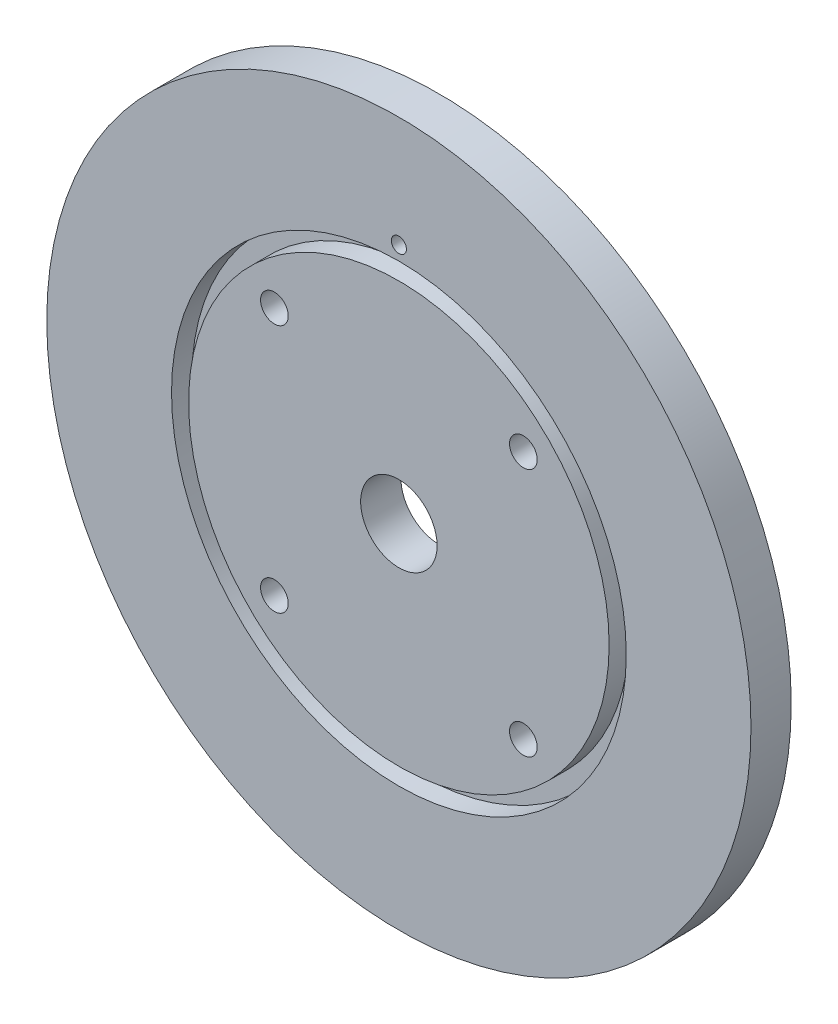
ISO-10303-21;
HEADER;
FILE_DESCRIPTION(('STEP AP214'),'2;1');
FILE_NAME('part.step','',(''),(''),'','','');
FILE_SCHEMA(('AUTOMOTIVE_DESIGN { 1 0 10303 214 1 1 1 1 }'));
ENDSEC;
DATA;
#1=APPLICATION_CONTEXT('core data for automotive mechanical design processes');
#2=APPLICATION_PROTOCOL_DEFINITION('international standard','automotive_design',2000,#1);
#3=PRODUCT_CONTEXT('',#1,'mechanical');
#4=PRODUCT('Part','Part','',(#3));
#5=PRODUCT_RELATED_PRODUCT_CATEGORY('part','',(#4));
#6=PRODUCT_DEFINITION_FORMATION('','',#4);
#7=PRODUCT_DEFINITION_CONTEXT('part definition',#1,'design');
#8=PRODUCT_DEFINITION('design','',#6,#7);
#9=PRODUCT_DEFINITION_SHAPE('','',#8);
#10=(LENGTH_UNIT() NAMED_UNIT(*) SI_UNIT(.MILLI.,.METRE.));
#11=(NAMED_UNIT(*) PLANE_ANGLE_UNIT() SI_UNIT($,.RADIAN.));
#12=(NAMED_UNIT(*) SI_UNIT($,.STERADIAN.) SOLID_ANGLE_UNIT());
#13=UNCERTAINTY_MEASURE_WITH_UNIT(LENGTH_MEASURE(1.E-05),#10,'distance_accuracy_value','');
#14=(GEOMETRIC_REPRESENTATION_CONTEXT(3) GLOBAL_UNCERTAINTY_ASSIGNED_CONTEXT((#13)) GLOBAL_UNIT_ASSIGNED_CONTEXT((#10,
#11,#12)) REPRESENTATION_CONTEXT('',''));
#15=CARTESIAN_POINT('',(0.,0.,0.));
#16=DIRECTION('',(0.,0.,1.));
#17=DIRECTION('',(1.,0.,0.));
#18=AXIS2_PLACEMENT_3D('',#15,#16,#17);
#19=CARTESIAN_POINT('',(0.,0.,0.));
#20=DIRECTION('',(0.,0.,1.));
#21=DIRECTION('',(1.,0.,0.));
#22=AXIS2_PLACEMENT_3D('',#19,#20,#21);
#23=PLANE('',#22);
#24=CARTESIAN_POINT('',(0.,0.,0.));
#25=DIRECTION('',(0.,0.,1.));
#26=DIRECTION('',(1.,0.,0.));
#27=AXIS2_PLACEMENT_3D('',#24,#25,#26);
#28=CIRCLE('',#27,7.6);
#29=CARTESIAN_POINT('',(7.6,0.,0.));
#30=VERTEX_POINT('',#29);
#31=EDGE_CURVE('E52',#30,#30,#28,.T.);
#32=ORIENTED_EDGE('',*,*,#31,.F.);
#33=EDGE_LOOP('',(#32));
#34=FACE_BOUND('',#33,.T.);
#35=CARTESIAN_POINT('',(24.7487373415292,24.7487373415292,0.));
#36=DIRECTION('',(0.,0.,1.));
#37=DIRECTION('',(1.,0.,0.));
#38=AXIS2_PLACEMENT_3D('',#35,#36,#37);
#39=CIRCLE('',#38,2.75);
#40=CARTESIAN_POINT('',(27.4987373415292,24.7487373415292,0.));
#41=VERTEX_POINT('',#40);
#42=EDGE_CURVE('E58',#41,#41,#39,.T.);
#43=ORIENTED_EDGE('',*,*,#42,.F.);
#44=EDGE_LOOP('',(#43));
#45=FACE_BOUND('',#44,.T.);
#46=CARTESIAN_POINT('',(-24.7487373415292,24.7487373415292,0.));
#47=DIRECTION('',(0.,0.,1.));
#48=DIRECTION('',(1.,0.,0.));
#49=AXIS2_PLACEMENT_3D('',#46,#47,#48);
#50=CIRCLE('',#49,2.75);
#51=CARTESIAN_POINT('',(-21.9987373415292,24.7487373415292,0.));
#52=VERTEX_POINT('',#51);
#53=EDGE_CURVE('E64',#52,#52,#50,.T.);
#54=ORIENTED_EDGE('',*,*,#53,.F.);
#55=EDGE_LOOP('',(#54));
#56=FACE_BOUND('',#55,.T.);
#57=CARTESIAN_POINT('',(-24.7487373415292,-24.7487373415292,0.));
#58=DIRECTION('',(0.,0.,1.));
#59=DIRECTION('',(1.,0.,0.));
#60=AXIS2_PLACEMENT_3D('',#57,#58,#59);
#61=CIRCLE('',#60,2.75);
#62=CARTESIAN_POINT('',(-21.9987373415292,-24.7487373415292,0.));
#63=VERTEX_POINT('',#62);
#64=EDGE_CURVE('E70',#63,#63,#61,.T.);
#65=ORIENTED_EDGE('',*,*,#64,.F.);
#66=EDGE_LOOP('',(#65));
#67=FACE_BOUND('',#66,.T.);
#68=CARTESIAN_POINT('',(24.7487373415292,-24.7487373415292,0.));
#69=DIRECTION('',(0.,0.,1.));
#70=DIRECTION('',(1.,0.,0.));
#71=AXIS2_PLACEMENT_3D('',#68,#69,#70);
#72=CIRCLE('',#71,2.75);
#73=CARTESIAN_POINT('',(27.4987373415292,-24.7487373415292,0.));
#74=VERTEX_POINT('',#73);
#75=EDGE_CURVE('E76',#74,#74,#72,.T.);
#76=ORIENTED_EDGE('',*,*,#75,.F.);
#77=EDGE_LOOP('',(#76));
#78=FACE_BOUND('',#77,.T.);
#79=CARTESIAN_POINT('',(0.,0.,0.));
#80=DIRECTION('',(0.,0.,1.));
#81=DIRECTION('',(1.,0.,0.));
#82=AXIS2_PLACEMENT_3D('',#79,#80,#81);
#83=CIRCLE('',#82,41.8);
#84=CARTESIAN_POINT('',(41.8,0.,0.));
#85=VERTEX_POINT('',#84);
#86=EDGE_CURVE('E94',#85,#85,#83,.T.);
#87=ORIENTED_EDGE('',*,*,#86,.T.);
#88=EDGE_LOOP('',(#87));
#89=FACE_BOUND('',#88,.T.);
#90=ADVANCED_FACE('F39',(#34,#45,#56,#67,#78,#89),#23,.T.);
#91=CARTESIAN_POINT('',(0.,0.,-8.));
#92=DIRECTION('',(0.,0.,1.));
#93=DIRECTION('',(1.,0.,0.));
#94=AXIS2_PLACEMENT_3D('',#91,#92,#93);
#95=CYLINDRICAL_SURFACE('',#94,70.);
#96=CARTESIAN_POINT('',(0.,0.,-8.));
#97=DIRECTION('',(0.,0.,1.));
#98=DIRECTION('',(1.,0.,0.));
#99=AXIS2_PLACEMENT_3D('',#96,#97,#98);
#100=CIRCLE('',#99,70.);
#101=CARTESIAN_POINT('',(70.,0.,-8.));
#102=VERTEX_POINT('',#101);
#103=EDGE_CURVE('E10',#102,#102,#100,.T.);
#104=ORIENTED_EDGE('',*,*,#103,.T.);
#105=EDGE_LOOP('',(#104));
#106=FACE_BOUND('',#105,.T.);
#107=CARTESIAN_POINT('',(0.,0.,0.));
#108=DIRECTION('',(0.,0.,1.));
#109=DIRECTION('',(1.,0.,0.));
#110=AXIS2_PLACEMENT_3D('',#107,#108,#109);
#111=CIRCLE('',#110,70.);
#112=CARTESIAN_POINT('',(70.,0.,0.));
#113=VERTEX_POINT('',#112);
#114=EDGE_CURVE('E43',#113,#113,#111,.T.);
#115=ORIENTED_EDGE('',*,*,#114,.F.);
#116=EDGE_LOOP('',(#115));
#117=FACE_BOUND('',#116,.T.);
#118=ADVANCED_FACE('F41',(#106,#117),#95,.T.);
#119=CARTESIAN_POINT('',(0.,0.,-8.));
#120=DIRECTION('',(0.,0.,1.));
#121=DIRECTION('',(1.,0.,0.));
#122=AXIS2_PLACEMENT_3D('',#119,#120,#121);
#123=PLANE('',#122);
#124=CARTESIAN_POINT('',(0.,48.,-8.));
#125=DIRECTION('',(0.,0.,1.));
#126=DIRECTION('',(1.,0.,0.));
#127=AXIS2_PLACEMENT_3D('',#124,#125,#126);
#128=CIRCLE('',#127,1.5);
#129=CARTESIAN_POINT('',(1.5,48.,-8.));
#130=VERTEX_POINT('',#129);
#131=EDGE_CURVE('E79',#130,#130,#128,.T.);
#132=ORIENTED_EDGE('',*,*,#131,.T.);
#133=EDGE_LOOP('',(#132));
#134=FACE_BOUND('',#133,.T.);
#135=CARTESIAN_POINT('',(24.7487373415292,-24.7487373415292,-8.));
#136=DIRECTION('',(0.,0.,1.));
#137=DIRECTION('',(1.,0.,0.));
#138=AXIS2_PLACEMENT_3D('',#135,#136,#137);
#139=CIRCLE('',#138,2.75);
#140=CARTESIAN_POINT('',(27.4987373415292,-24.7487373415292,-8.));
#141=VERTEX_POINT('',#140);
#142=EDGE_CURVE('E73',#141,#141,#139,.T.);
#143=ORIENTED_EDGE('',*,*,#142,.T.);
#144=EDGE_LOOP('',(#143));
#145=FACE_BOUND('',#144,.T.);
#146=CARTESIAN_POINT('',(-24.7487373415292,-24.7487373415292,-8.));
#147=DIRECTION('',(0.,0.,1.));
#148=DIRECTION('',(1.,0.,0.));
#149=AXIS2_PLACEMENT_3D('',#146,#147,#148);
#150=CIRCLE('',#149,2.75);
#151=CARTESIAN_POINT('',(-21.9987373415292,-24.7487373415292,-8.));
#152=VERTEX_POINT('',#151);
#153=EDGE_CURVE('E67',#152,#152,#150,.T.);
#154=ORIENTED_EDGE('',*,*,#153,.T.);
#155=EDGE_LOOP('',(#154));
#156=FACE_BOUND('',#155,.T.);
#157=CARTESIAN_POINT('',(-24.7487373415292,24.7487373415292,-8.));
#158=DIRECTION('',(0.,0.,1.));
#159=DIRECTION('',(1.,0.,0.));
#160=AXIS2_PLACEMENT_3D('',#157,#158,#159);
#161=CIRCLE('',#160,2.75);
#162=CARTESIAN_POINT('',(-21.9987373415292,24.7487373415292,-8.));
#163=VERTEX_POINT('',#162);
#164=EDGE_CURVE('E61',#163,#163,#161,.T.);
#165=ORIENTED_EDGE('',*,*,#164,.T.);
#166=EDGE_LOOP('',(#165));
#167=FACE_BOUND('',#166,.T.);
#168=CARTESIAN_POINT('',(24.7487373415292,24.7487373415292,-8.));
#169=DIRECTION('',(0.,0.,1.));
#170=DIRECTION('',(1.,0.,0.));
#171=AXIS2_PLACEMENT_3D('',#168,#169,#170);
#172=CIRCLE('',#171,2.75);
#173=CARTESIAN_POINT('',(27.4987373415292,24.7487373415292,-8.));
#174=VERTEX_POINT('',#173);
#175=EDGE_CURVE('E55',#174,#174,#172,.T.);
#176=ORIENTED_EDGE('',*,*,#175,.T.);
#177=EDGE_LOOP('',(#176));
#178=FACE_BOUND('',#177,.T.);
#179=CARTESIAN_POINT('',(0.,0.,-8.));
#180=DIRECTION('',(0.,0.,1.));
#181=DIRECTION('',(1.,0.,0.));
#182=AXIS2_PLACEMENT_3D('',#179,#180,#181);
#183=CIRCLE('',#182,7.6);
#184=CARTESIAN_POINT('',(7.6,0.,-8.));
#185=VERTEX_POINT('',#184);
#186=EDGE_CURVE('E50',#185,#185,#183,.T.);
#187=ORIENTED_EDGE('',*,*,#186,.T.);
#188=EDGE_LOOP('',(#187));
#189=FACE_BOUND('',#188,.T.);
#190=ORIENTED_EDGE('',*,*,#103,.F.);
#191=EDGE_LOOP('',(#190));
#192=FACE_BOUND('',#191,.T.);
#193=ADVANCED_FACE('F120',(#134,#145,#156,#167,#178,#189,#192),#123,.F.);
#194=CARTESIAN_POINT('',(0.,0.,0.));
#195=DIRECTION('',(0.,0.,1.));
#196=DIRECTION('',(1.,0.,0.));
#197=AXIS2_PLACEMENT_3D('',#194,#195,#196);
#198=CIRCLE('',#197,45.2);
#199=CARTESIAN_POINT('',(45.2,0.,0.));
#200=VERTEX_POINT('',#199);
#201=EDGE_CURVE('E88',#200,#200,#198,.T.);
#202=ORIENTED_EDGE('',*,*,#201,.F.);
#203=EDGE_LOOP('',(#202));
#204=FACE_BOUND('',#203,.T.);
#205=CARTESIAN_POINT('',(0.,48.,0.));
#206=DIRECTION('',(0.,0.,1.));
#207=DIRECTION('',(1.,0.,0.));
#208=AXIS2_PLACEMENT_3D('',#205,#206,#207);
#209=CIRCLE('',#208,1.5);
#210=CARTESIAN_POINT('',(1.5,48.,0.));
#211=VERTEX_POINT('',#210);
#212=EDGE_CURVE('E82',#211,#211,#209,.T.);
#213=ORIENTED_EDGE('',*,*,#212,.F.);
#214=EDGE_LOOP('',(#213));
#215=FACE_BOUND('',#214,.T.);
#216=ORIENTED_EDGE('',*,*,#114,.T.);
#217=EDGE_LOOP('',(#216));
#218=FACE_BOUND('',#217,.T.);
#219=ADVANCED_FACE('F116',(#204,#215,#218),#23,.T.);
#220=CARTESIAN_POINT('',(0.,0.,-8.));
#221=DIRECTION('',(0.,0.,1.));
#222=DIRECTION('',(1.,0.,0.));
#223=AXIS2_PLACEMENT_3D('',#220,#221,#222);
#224=CYLINDRICAL_SURFACE('',#223,7.6);
#225=ORIENTED_EDGE('',*,*,#186,.F.);
#226=EDGE_LOOP('',(#225));
#227=FACE_BOUND('',#226,.T.);
#228=ORIENTED_EDGE('',*,*,#31,.T.);
#229=EDGE_LOOP('',(#228));
#230=FACE_BOUND('',#229,.T.);
#231=ADVANCED_FACE('F119',(#227,#230),#224,.F.);
#232=CARTESIAN_POINT('',(24.7487373415292,24.7487373415292,-8.));
#233=DIRECTION('',(0.,0.,1.));
#234=DIRECTION('',(1.,0.,0.));
#235=AXIS2_PLACEMENT_3D('',#232,#233,#234);
#236=CYLINDRICAL_SURFACE('',#235,2.75);
#237=ORIENTED_EDGE('',*,*,#175,.F.);
#238=EDGE_LOOP('',(#237));
#239=FACE_BOUND('',#238,.T.);
#240=ORIENTED_EDGE('',*,*,#42,.T.);
#241=EDGE_LOOP('',(#240));
#242=FACE_BOUND('',#241,.T.);
#243=ADVANCED_FACE('F140',(#239,#242),#236,.F.);
#244=CARTESIAN_POINT('',(-24.7487373415292,24.7487373415292,-8.));
#245=DIRECTION('',(0.,0.,1.));
#246=DIRECTION('',(1.,0.,0.));
#247=AXIS2_PLACEMENT_3D('',#244,#245,#246);
#248=CYLINDRICAL_SURFACE('',#247,2.75);
#249=ORIENTED_EDGE('',*,*,#164,.F.);
#250=EDGE_LOOP('',(#249));
#251=FACE_BOUND('',#250,.T.);
#252=ORIENTED_EDGE('',*,*,#53,.T.);
#253=EDGE_LOOP('',(#252));
#254=FACE_BOUND('',#253,.T.);
#255=ADVANCED_FACE('F144',(#251,#254),#248,.F.);
#256=CARTESIAN_POINT('',(-24.7487373415292,-24.7487373415292,-8.));
#257=DIRECTION('',(0.,0.,1.));
#258=DIRECTION('',(1.,0.,0.));
#259=AXIS2_PLACEMENT_3D('',#256,#257,#258);
#260=CYLINDRICAL_SURFACE('',#259,2.75);
#261=ORIENTED_EDGE('',*,*,#153,.F.);
#262=EDGE_LOOP('',(#261));
#263=FACE_BOUND('',#262,.T.);
#264=ORIENTED_EDGE('',*,*,#64,.T.);
#265=EDGE_LOOP('',(#264));
#266=FACE_BOUND('',#265,.T.);
#267=ADVANCED_FACE('F148',(#263,#266),#260,.F.);
#268=CARTESIAN_POINT('',(24.7487373415292,-24.7487373415292,-8.));
#269=DIRECTION('',(0.,0.,1.));
#270=DIRECTION('',(1.,0.,0.));
#271=AXIS2_PLACEMENT_3D('',#268,#269,#270);
#272=CYLINDRICAL_SURFACE('',#271,2.75);
#273=ORIENTED_EDGE('',*,*,#142,.F.);
#274=EDGE_LOOP('',(#273));
#275=FACE_BOUND('',#274,.T.);
#276=ORIENTED_EDGE('',*,*,#75,.T.);
#277=EDGE_LOOP('',(#276));
#278=FACE_BOUND('',#277,.T.);
#279=ADVANCED_FACE('F152',(#275,#278),#272,.F.);
#280=CARTESIAN_POINT('',(0.,48.,-8.));
#281=DIRECTION('',(0.,0.,1.));
#282=DIRECTION('',(1.,0.,0.));
#283=AXIS2_PLACEMENT_3D('',#280,#281,#282);
#284=CYLINDRICAL_SURFACE('',#283,1.5);
#285=ORIENTED_EDGE('',*,*,#131,.F.);
#286=EDGE_LOOP('',(#285));
#287=FACE_BOUND('',#286,.T.);
#288=ORIENTED_EDGE('',*,*,#212,.T.);
#289=EDGE_LOOP('',(#288));
#290=FACE_BOUND('',#289,.T.);
#291=ADVANCED_FACE('F112',(#287,#290),#284,.F.);
#292=CARTESIAN_POINT('',(0.,0.,-4.));
#293=DIRECTION('',(0.,0.,1.));
#294=DIRECTION('',(1.,0.,0.));
#295=AXIS2_PLACEMENT_3D('',#292,#293,#294);
#296=CYLINDRICAL_SURFACE('',#295,45.2);
#297=CARTESIAN_POINT('',(0.,0.,-4.));
#298=DIRECTION('',(0.,0.,1.));
#299=DIRECTION('',(1.,0.,0.));
#300=AXIS2_PLACEMENT_3D('',#297,#298,#299);
#301=CIRCLE('',#300,45.2);
#302=CARTESIAN_POINT('',(45.2,0.,-4.));
#303=VERTEX_POINT('',#302);
#304=EDGE_CURVE('E85',#303,#303,#301,.T.);
#305=ORIENTED_EDGE('',*,*,#304,.F.);
#306=EDGE_LOOP('',(#305));
#307=FACE_BOUND('',#306,.T.);
#308=ORIENTED_EDGE('',*,*,#201,.T.);
#309=EDGE_LOOP('',(#308));
#310=FACE_BOUND('',#309,.T.);
#311=ADVANCED_FACE('F106',(#307,#310),#296,.F.);
#312=CARTESIAN_POINT('',(0.,0.,-4.));
#313=DIRECTION('',(0.,0.,1.));
#314=DIRECTION('',(1.,0.,0.));
#315=AXIS2_PLACEMENT_3D('',#312,#313,#314);
#316=PLANE('',#315);
#317=CARTESIAN_POINT('',(0.,0.,-4.));
#318=DIRECTION('',(0.,0.,1.));
#319=DIRECTION('',(1.,0.,0.));
#320=AXIS2_PLACEMENT_3D('',#317,#318,#319);
#321=CIRCLE('',#320,41.8);
#322=CARTESIAN_POINT('',(41.8,0.,-4.));
#323=VERTEX_POINT('',#322);
#324=EDGE_CURVE('E91',#323,#323,#321,.T.);
#325=ORIENTED_EDGE('',*,*,#324,.F.);
#326=EDGE_LOOP('',(#325));
#327=FACE_BOUND('',#326,.T.);
#328=ORIENTED_EDGE('',*,*,#304,.T.);
#329=EDGE_LOOP('',(#328));
#330=FACE_BOUND('',#329,.T.);
#331=ADVANCED_FACE('F103',(#327,#330),#316,.T.);
#332=CARTESIAN_POINT('',(0.,0.,-4.));
#333=DIRECTION('',(0.,0.,1.));
#334=DIRECTION('',(1.,0.,0.));
#335=AXIS2_PLACEMENT_3D('',#332,#333,#334);
#336=CYLINDRICAL_SURFACE('',#335,41.8);
#337=ORIENTED_EDGE('',*,*,#324,.T.);
#338=EDGE_LOOP('',(#337));
#339=FACE_BOUND('',#338,.T.);
#340=ORIENTED_EDGE('',*,*,#86,.F.);
#341=EDGE_LOOP('',(#340));
#342=FACE_BOUND('',#341,.T.);
#343=ADVANCED_FACE('F100',(#339,#342),#336,.T.);
#344=CLOSED_SHELL('',(#90,#118,#193,#219,#231,#243,#255,#267,#279,#291,#311,#331,#343));
#345=MANIFOLD_SOLID_BREP('B2',#344);
#346=ADVANCED_BREP_SHAPE_REPRESENTATION('',(#18,#345),#14);
#347=SHAPE_DEFINITION_REPRESENTATION(#9,#346);
ENDSEC;
END-ISO-10303-21;
